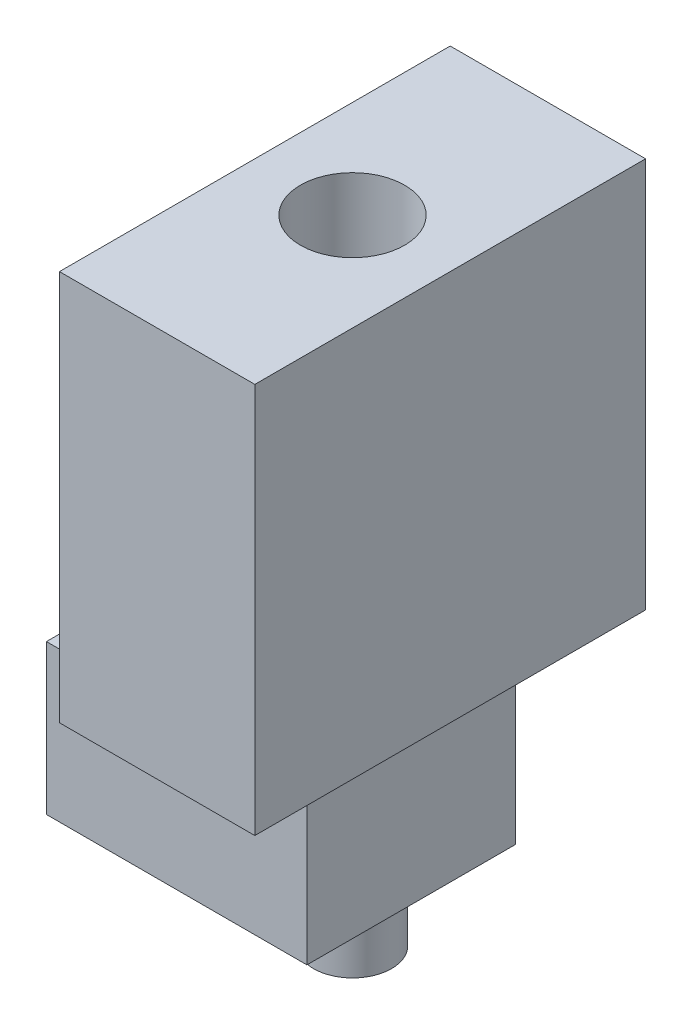
ISO-10303-21;
HEADER;
FILE_DESCRIPTION(('STEP AP214'),'2;1');
FILE_NAME('part.step','',(''),(''),'','','');
FILE_SCHEMA(('AUTOMOTIVE_DESIGN { 1 0 10303 214 1 1 1 1 }'));
ENDSEC;
DATA;
#1=APPLICATION_CONTEXT('core data for automotive mechanical design processes');
#2=APPLICATION_PROTOCOL_DEFINITION('international standard','automotive_design',2000,#1);
#3=PRODUCT_CONTEXT('',#1,'mechanical');
#4=PRODUCT('Part','Part','',(#3));
#5=PRODUCT_RELATED_PRODUCT_CATEGORY('part','',(#4));
#6=PRODUCT_DEFINITION_FORMATION('','',#4);
#7=PRODUCT_DEFINITION_CONTEXT('part definition',#1,'design');
#8=PRODUCT_DEFINITION('design','',#6,#7);
#9=PRODUCT_DEFINITION_SHAPE('','',#8);
#10=(LENGTH_UNIT() NAMED_UNIT(*) SI_UNIT(.MILLI.,.METRE.));
#11=(NAMED_UNIT(*) PLANE_ANGLE_UNIT() SI_UNIT($,.RADIAN.));
#12=(NAMED_UNIT(*) SI_UNIT($,.STERADIAN.) SOLID_ANGLE_UNIT());
#13=UNCERTAINTY_MEASURE_WITH_UNIT(LENGTH_MEASURE(1.E-05),#10,'distance_accuracy_value','');
#14=(GEOMETRIC_REPRESENTATION_CONTEXT(3) GLOBAL_UNCERTAINTY_ASSIGNED_CONTEXT((#13)) GLOBAL_UNIT_ASSIGNED_CONTEXT((#10,
#11,#12)) REPRESENTATION_CONTEXT('',''));
#15=CARTESIAN_POINT('',(0.,0.,0.));
#16=DIRECTION('',(0.,0.,1.));
#17=DIRECTION('',(1.,0.,0.));
#18=AXIS2_PLACEMENT_3D('',#15,#16,#17);
#19=CARTESIAN_POINT('',(7.5,-0.1,-15.));
#20=DIRECTION('',(0.,1.,0.));
#21=DIRECTION('',(0.,0.,1.));
#22=AXIS2_PLACEMENT_3D('',#19,#20,#21);
#23=CYLINDRICAL_SURFACE('',#22,4.);
#24=CARTESIAN_POINT('',(7.5,-0.1,-15.));
#25=DIRECTION('',(0.,-1.,0.));
#26=DIRECTION('',(0.,0.,-1.));
#27=AXIS2_PLACEMENT_3D('',#24,#25,#26);
#28=CIRCLE('',#27,4.);
#29=CARTESIAN_POINT('',(7.5,-0.1,-19.));
#30=VERTEX_POINT('',#29);
#31=EDGE_CURVE('E54',#30,#30,#28,.T.);
#32=ORIENTED_EDGE('',*,*,#31,.F.);
#33=EDGE_LOOP('',(#32));
#34=FACE_BOUND('',#33,.T.);
#35=CARTESIAN_POINT('',(7.5,0.,-15.));
#36=DIRECTION('',(0.,-1.,0.));
#37=DIRECTION('',(0.,0.,-1.));
#38=AXIS2_PLACEMENT_3D('',#35,#36,#37);
#39=CIRCLE('',#38,4.);
#40=CARTESIAN_POINT('',(7.5,0.,-19.));
#41=VERTEX_POINT('',#40);
#42=EDGE_CURVE('E48',#41,#41,#39,.T.);
#43=ORIENTED_EDGE('',*,*,#42,.T.);
#44=EDGE_LOOP('',(#43));
#45=FACE_BOUND('',#44,.T.);
#46=ADVANCED_FACE('F45',(#34,#45),#23,.T.);
#47=CARTESIAN_POINT('',(7.5,-0.1,-15.));
#48=DIRECTION('',(0.,-1.,0.));
#49=DIRECTION('',(0.,0.,-1.));
#50=AXIS2_PLACEMENT_3D('',#47,#48,#49);
#51=PLANE('',#50);
#52=CARTESIAN_POINT('',(7.5,-0.1,-15.));
#53=DIRECTION('',(0.,-1.,0.));
#54=DIRECTION('',(0.,0.,-1.));
#55=AXIS2_PLACEMENT_3D('',#52,#53,#54);
#56=CIRCLE('',#55,1.5);
#57=CARTESIAN_POINT('',(7.5,-0.1,-16.5));
#58=VERTEX_POINT('',#57);
#59=EDGE_CURVE('E12',#58,#58,#56,.T.);
#60=ORIENTED_EDGE('',*,*,#59,.F.);
#61=EDGE_LOOP('',(#60));
#62=FACE_BOUND('',#61,.T.);
#63=ORIENTED_EDGE('',*,*,#31,.T.);
#64=EDGE_LOOP('',(#63));
#65=FACE_BOUND('',#64,.T.);
#66=ADVANCED_FACE('F136',(#62,#65),#51,.T.);
#67=CARTESIAN_POINT('',(7.5,0.,-15.));
#68=DIRECTION('',(0.,-1.,0.));
#69=DIRECTION('',(0.,0.,-1.));
#70=AXIS2_PLACEMENT_3D('',#67,#68,#69);
#71=PLANE('',#70);
#72=ORIENTED_EDGE('',*,*,#42,.F.);
#73=EDGE_LOOP('',(#72));
#74=FACE_BOUND('',#73,.T.);
#75=ADVANCED_FACE('F133',(#74),#71,.F.);
#76=CARTESIAN_POINT('',(7.5,-2.1,-15.));
#77=DIRECTION('',(0.,1.,0.));
#78=DIRECTION('',(0.,0.,1.));
#79=AXIS2_PLACEMENT_3D('',#76,#77,#78);
#80=CYLINDRICAL_SURFACE('',#79,1.5);
#81=CARTESIAN_POINT('',(7.5,-2.1,-15.));
#82=DIRECTION('',(0.,-1.,0.));
#83=DIRECTION('',(0.,0.,-1.));
#84=AXIS2_PLACEMENT_3D('',#81,#82,#83);
#85=CIRCLE('',#84,1.5);
#86=CARTESIAN_POINT('',(7.5,-2.1,-16.5));
#87=VERTEX_POINT('',#86);
#88=EDGE_CURVE('E124',#87,#87,#85,.T.);
#89=ORIENTED_EDGE('',*,*,#88,.F.);
#90=EDGE_LOOP('',(#89));
#91=FACE_BOUND('',#90,.T.);
#92=ORIENTED_EDGE('',*,*,#59,.T.);
#93=EDGE_LOOP('',(#92));
#94=FACE_BOUND('',#93,.T.);
#95=ADVANCED_FACE('F135',(#91,#94),#80,.T.);
#96=CARTESIAN_POINT('',(-8.,-13.6,-6.99999999999999));
#97=DIRECTION('',(1.,0.,0.));
#98=DIRECTION('',(0.,0.,-1.));
#99=AXIS2_PLACEMENT_3D('',#96,#97,#98);
#100=PLANE('',#99);
#101=DIRECTION('',(0.,0.,-1.));
#102=VECTOR('',#101,1.);
#103=CARTESIAN_POINT('',(-8.,-2.1,-6.99999999999999));
#104=LINE('',#103,#102);
#105=CARTESIAN_POINT('',(-8.,-2.1,-6.99999999999999));
#106=VERTEX_POINT('',#105);
#107=CARTESIAN_POINT('',(-8.,-2.1,-23.));
#108=VERTEX_POINT('',#107);
#109=EDGE_CURVE('E114',#106,#108,#104,.T.);
#110=ORIENTED_EDGE('',*,*,#109,.T.);
#111=DIRECTION('',(0.,1.,0.));
#112=VECTOR('',#111,1.);
#113=CARTESIAN_POINT('',(-8.,-13.6,-23.));
#114=LINE('',#113,#112);
#115=CARTESIAN_POINT('',(-8.,-13.6,-23.));
#116=VERTEX_POINT('',#115);
#117=EDGE_CURVE('E105',#116,#108,#114,.T.);
#118=ORIENTED_EDGE('',*,*,#117,.F.);
#119=DIRECTION('',(0.,0.,-1.));
#120=VECTOR('',#119,1.);
#121=CARTESIAN_POINT('',(-8.,-13.6,-6.99999999999999));
#122=LINE('',#121,#120);
#123=CARTESIAN_POINT('',(-8.,-13.6,-6.99999999999999));
#124=VERTEX_POINT('',#123);
#125=EDGE_CURVE('E99',#124,#116,#122,.T.);
#126=ORIENTED_EDGE('',*,*,#125,.F.);
#127=DIRECTION('',(0.,1.,0.));
#128=VECTOR('',#127,1.);
#129=CARTESIAN_POINT('',(-8.,-13.6,-6.99999999999999));
#130=LINE('',#129,#128);
#131=EDGE_CURVE('E110',#124,#106,#130,.T.);
#132=ORIENTED_EDGE('',*,*,#131,.T.);
#133=EDGE_LOOP('',(#110,#118,#126,#132));
#134=FACE_BOUND('',#133,.T.);
#135=ADVANCED_FACE('F141',(#134),#100,.F.);
#136=CARTESIAN_POINT('',(-8.,-13.6,-23.));
#137=DIRECTION('',(0.,0.,1.));
#138=DIRECTION('',(1.,0.,0.));
#139=AXIS2_PLACEMENT_3D('',#136,#137,#138);
#140=PLANE('',#139);
#141=DIRECTION('',(1.,0.,0.));
#142=VECTOR('',#141,1.);
#143=CARTESIAN_POINT('',(-8.,-2.1,-23.));
#144=LINE('',#143,#142);
#145=CARTESIAN_POINT('',(12.,-2.1,-23.));
#146=VERTEX_POINT('',#145);
#147=EDGE_CURVE('E104',#108,#146,#144,.T.);
#148=ORIENTED_EDGE('',*,*,#147,.T.);
#149=DIRECTION('',(0.,1.,0.));
#150=VECTOR('',#149,1.);
#151=CARTESIAN_POINT('',(12.,-13.6,-23.));
#152=LINE('',#151,#150);
#153=CARTESIAN_POINT('',(12.,-13.6,-23.));
#154=VERTEX_POINT('',#153);
#155=EDGE_CURVE('E102',#154,#146,#152,.T.);
#156=ORIENTED_EDGE('',*,*,#155,.F.);
#157=DIRECTION('',(1.,0.,0.));
#158=VECTOR('',#157,1.);
#159=CARTESIAN_POINT('',(-8.,-13.6,-23.));
#160=LINE('',#159,#158);
#161=EDGE_CURVE('E94',#116,#154,#160,.T.);
#162=ORIENTED_EDGE('',*,*,#161,.F.);
#163=ORIENTED_EDGE('',*,*,#117,.T.);
#164=EDGE_LOOP('',(#148,#156,#162,#163));
#165=FACE_BOUND('',#164,.T.);
#166=ADVANCED_FACE('F103',(#165),#140,.F.);
#167=CARTESIAN_POINT('',(12.,-13.6,-6.99999999999999));
#168=DIRECTION('',(-1.,0.,0.));
#169=DIRECTION('',(0.,0.,1.));
#170=AXIS2_PLACEMENT_3D('',#167,#168,#169);
#171=PLANE('',#170);
#172=DIRECTION('',(0.,0.,1.));
#173=VECTOR('',#172,1.);
#174=CARTESIAN_POINT('',(12.,-2.1,-6.99999999999999));
#175=LINE('',#174,#173);
#176=CARTESIAN_POINT('',(12.,-2.1,-6.99999999999999));
#177=VERTEX_POINT('',#176);
#178=EDGE_CURVE('E80',#146,#177,#175,.T.);
#179=ORIENTED_EDGE('',*,*,#178,.T.);
#180=DIRECTION('',(0.,1.,0.));
#181=VECTOR('',#180,1.);
#182=CARTESIAN_POINT('',(12.,-13.6,-6.99999999999999));
#183=LINE('',#182,#181);
#184=CARTESIAN_POINT('',(12.,-13.6,-6.99999999999999));
#185=VERTEX_POINT('',#184);
#186=EDGE_CURVE('E106',#185,#177,#183,.T.);
#187=ORIENTED_EDGE('',*,*,#186,.F.);
#188=DIRECTION('',(0.,0.,1.));
#189=VECTOR('',#188,1.);
#190=CARTESIAN_POINT('',(12.,-13.6,-6.99999999999999));
#191=LINE('',#190,#189);
#192=EDGE_CURVE('E97',#154,#185,#191,.T.);
#193=ORIENTED_EDGE('',*,*,#192,.F.);
#194=ORIENTED_EDGE('',*,*,#155,.T.);
#195=EDGE_LOOP('',(#179,#187,#193,#194));
#196=FACE_BOUND('',#195,.T.);
#197=ADVANCED_FACE('F108',(#196),#171,.F.);
#198=CARTESIAN_POINT('',(-8.,-13.6,-6.99999999999999));
#199=DIRECTION('',(0.,0.,-1.));
#200=DIRECTION('',(-1.,0.,0.));
#201=AXIS2_PLACEMENT_3D('',#198,#199,#200);
#202=PLANE('',#201);
#203=DIRECTION('',(-1.,0.,0.));
#204=VECTOR('',#203,1.);
#205=CARTESIAN_POINT('',(-8.,-2.1,-6.99999999999999));
#206=LINE('',#205,#204);
#207=EDGE_CURVE('E86',#177,#106,#206,.T.);
#208=ORIENTED_EDGE('',*,*,#207,.T.);
#209=ORIENTED_EDGE('',*,*,#131,.F.);
#210=DIRECTION('',(-1.,0.,0.));
#211=VECTOR('',#210,1.);
#212=CARTESIAN_POINT('',(-8.,-13.6,-6.99999999999999));
#213=LINE('',#212,#211);
#214=EDGE_CURVE('E63',#185,#124,#213,.T.);
#215=ORIENTED_EDGE('',*,*,#214,.F.);
#216=ORIENTED_EDGE('',*,*,#186,.T.);
#217=EDGE_LOOP('',(#208,#209,#215,#216));
#218=FACE_BOUND('',#217,.T.);
#219=ADVANCED_FACE('F188',(#218),#202,.F.);
#220=CARTESIAN_POINT('',(0.,-13.6,0.));
#221=DIRECTION('',(0.,-1.,0.));
#222=DIRECTION('',(0.,0.,-1.));
#223=AXIS2_PLACEMENT_3D('',#220,#221,#222);
#224=PLANE('',#223);
#225=CARTESIAN_POINT('',(7.5,-13.6,-15.));
#226=DIRECTION('',(0.,-1.,0.));
#227=DIRECTION('',(0.,0.,-1.));
#228=AXIS2_PLACEMENT_3D('',#225,#226,#227);
#229=CIRCLE('',#228,3.);
#230=CARTESIAN_POINT('',(7.5,-13.6,-18.));
#231=VERTEX_POINT('',#230);
#232=EDGE_CURVE('E241',#231,#231,#229,.T.);
#233=ORIENTED_EDGE('',*,*,#232,.F.);
#234=EDGE_LOOP('',(#233));
#235=FACE_BOUND('',#234,.T.);
#236=ORIENTED_EDGE('',*,*,#125,.T.);
#237=ORIENTED_EDGE('',*,*,#161,.T.);
#238=ORIENTED_EDGE('',*,*,#192,.T.);
#239=ORIENTED_EDGE('',*,*,#214,.T.);
#240=EDGE_LOOP('',(#236,#237,#238,#239));
#241=FACE_BOUND('',#240,.T.);
#242=ADVANCED_FACE('F95',(#235,#241),#224,.T.);
#243=CARTESIAN_POINT('',(0.,-2.1,0.));
#244=DIRECTION('',(0.,-1.,0.));
#245=DIRECTION('',(0.,0.,-1.));
#246=AXIS2_PLACEMENT_3D('',#243,#244,#245);
#247=PLANE('',#246);
#248=ORIENTED_EDGE('',*,*,#88,.T.);
#249=EDGE_LOOP('',(#248));
#250=FACE_BOUND('',#249,.T.);
#251=ORIENTED_EDGE('',*,*,#109,.F.);
#252=ORIENTED_EDGE('',*,*,#207,.F.);
#253=ORIENTED_EDGE('',*,*,#178,.F.);
#254=ORIENTED_EDGE('',*,*,#147,.F.);
#255=EDGE_LOOP('',(#251,#252,#253,#254));
#256=FACE_BOUND('',#255,.T.);
#257=ADVANCED_FACE('F203',(#250,#256),#247,.F.);
#258=CARTESIAN_POINT('',(7.5,-18.6,-15.));
#259=DIRECTION('',(0.,1.,0.));
#260=DIRECTION('',(0.,0.,1.));
#261=AXIS2_PLACEMENT_3D('',#258,#259,#260);
#262=CYLINDRICAL_SURFACE('',#261,3.);
#263=CARTESIAN_POINT('',(7.5,-18.6,-15.));
#264=DIRECTION('',(0.,-1.,0.));
#265=DIRECTION('',(0.,0.,-1.));
#266=AXIS2_PLACEMENT_3D('',#263,#264,#265);
#267=CIRCLE('',#266,3.);
#268=CARTESIAN_POINT('',(7.5,-18.6,-18.));
#269=VERTEX_POINT('',#268);
#270=EDGE_CURVE('E117',#269,#269,#267,.T.);
#271=ORIENTED_EDGE('',*,*,#270,.F.);
#272=EDGE_LOOP('',(#271));
#273=FACE_BOUND('',#272,.T.);
#274=ORIENTED_EDGE('',*,*,#232,.T.);
#275=EDGE_LOOP('',(#274));
#276=FACE_BOUND('',#275,.T.);
#277=ADVANCED_FACE('F208',(#273,#276),#262,.T.);
#278=CARTESIAN_POINT('',(7.5,-18.6,-15.));
#279=DIRECTION('',(0.,-1.,0.));
#280=DIRECTION('',(0.,0.,-1.));
#281=AXIS2_PLACEMENT_3D('',#278,#279,#280);
#282=PLANE('',#281);
#283=ORIENTED_EDGE('',*,*,#270,.T.);
#284=EDGE_LOOP('',(#283));
#285=FACE_BOUND('',#284,.T.);
#286=ADVANCED_FACE('F225',(#285),#282,.T.);
#287=CLOSED_SHELL('',(#46,#66,#75,#95,#135,#166,#197,#219,#242,#257,#277,#286));
#288=MANIFOLD_SOLID_BREP('B2',#287);
#289=CARTESIAN_POINT('',(15.,0.,0.));
#290=DIRECTION('',(0.,0.,-1.));
#291=DIRECTION('',(0.,1.,0.));
#292=AXIS2_PLACEMENT_3D('',#289,#290,#291);
#293=PLANE('',#292);
#294=DIRECTION('',(0.,-1.,0.));
#295=VECTOR('',#294,1.);
#296=CARTESIAN_POINT('',(0.,0.,0.));
#297=LINE('',#296,#295);
#298=CARTESIAN_POINT('',(0.,30.,0.));
#299=VERTEX_POINT('',#298);
#300=CARTESIAN_POINT('',(0.,0.,0.));
#301=VERTEX_POINT('',#300);
#302=EDGE_CURVE('E321',#299,#301,#297,.T.);
#303=ORIENTED_EDGE('',*,*,#302,.T.);
#304=DIRECTION('',(-1.,0.,0.));
#305=VECTOR('',#304,1.);
#306=CARTESIAN_POINT('',(15.,0.,0.));
#307=LINE('',#306,#305);
#308=CARTESIAN_POINT('',(15.,0.,0.));
#309=VERTEX_POINT('',#308);
#310=EDGE_CURVE('E43',#309,#301,#307,.T.);
#311=ORIENTED_EDGE('',*,*,#310,.F.);
#312=DIRECTION('',(0.,-1.,0.));
#313=VECTOR('',#312,1.);
#314=CARTESIAN_POINT('',(15.,0.,0.));
#315=LINE('',#314,#313);
#316=CARTESIAN_POINT('',(15.,30.,0.));
#317=VERTEX_POINT('',#316);
#318=EDGE_CURVE('E309',#317,#309,#315,.T.);
#319=ORIENTED_EDGE('',*,*,#318,.F.);
#320=DIRECTION('',(-1.,0.,0.));
#321=VECTOR('',#320,1.);
#322=CARTESIAN_POINT('',(15.,30.,0.));
#323=LINE('',#322,#321);
#324=EDGE_CURVE('E317',#317,#299,#323,.T.);
#325=ORIENTED_EDGE('',*,*,#324,.T.);
#326=EDGE_LOOP('',(#303,#311,#319,#325));
#327=FACE_BOUND('',#326,.T.);
#328=ADVANCED_FACE('F258',(#327),#293,.F.);
#329=CARTESIAN_POINT('',(15.,0.,0.));
#330=DIRECTION('',(0.,1.,0.));
#331=DIRECTION('',(0.,0.,1.));
#332=AXIS2_PLACEMENT_3D('',#329,#330,#331);
#333=PLANE('',#332);
#334=CARTESIAN_POINT('',(7.5,0.,-15.));
#335=DIRECTION('',(0.,1.,0.));
#336=DIRECTION('',(0.,0.,1.));
#337=AXIS2_PLACEMENT_3D('',#334,#335,#336);
#338=CIRCLE('',#337,4.);
#339=CARTESIAN_POINT('',(7.5,0.,-11.));
#340=VERTEX_POINT('',#339);
#341=EDGE_CURVE('E324',#340,#340,#338,.T.);
#342=ORIENTED_EDGE('',*,*,#341,.T.);
#343=EDGE_LOOP('',(#342));
#344=FACE_BOUND('',#343,.T.);
#345=DIRECTION('',(0.,0.,-1.));
#346=VECTOR('',#345,1.);
#347=CARTESIAN_POINT('',(0.,0.,0.));
#348=LINE('',#347,#346);
#349=CARTESIAN_POINT('',(0.,0.,-30.));
#350=VERTEX_POINT('',#349);
#351=EDGE_CURVE('E313',#301,#350,#348,.T.);
#352=ORIENTED_EDGE('',*,*,#351,.T.);
#353=DIRECTION('',(-1.,0.,0.));
#354=VECTOR('',#353,1.);
#355=CARTESIAN_POINT('',(15.,0.,-30.));
#356=LINE('',#355,#354);
#357=CARTESIAN_POINT('',(15.,0.,-30.));
#358=VERTEX_POINT('',#357);
#359=EDGE_CURVE('E266',#358,#350,#356,.T.);
#360=ORIENTED_EDGE('',*,*,#359,.F.);
#361=DIRECTION('',(0.,0.,-1.));
#362=VECTOR('',#361,1.);
#363=CARTESIAN_POINT('',(15.,0.,0.));
#364=LINE('',#363,#362);
#365=EDGE_CURVE('E304',#309,#358,#364,.T.);
#366=ORIENTED_EDGE('',*,*,#365,.F.);
#367=ORIENTED_EDGE('',*,*,#310,.T.);
#368=EDGE_LOOP('',(#352,#360,#366,#367));
#369=FACE_BOUND('',#368,.T.);
#370=ADVANCED_FACE('F312',(#344,#369),#333,.F.);
#371=CARTESIAN_POINT('',(15.,0.,-30.));
#372=DIRECTION('',(0.,0.,1.));
#373=DIRECTION('',(0.,-1.,0.));
#374=AXIS2_PLACEMENT_3D('',#371,#372,#373);
#375=PLANE('',#374);
#376=DIRECTION('',(0.,1.,0.));
#377=VECTOR('',#376,1.);
#378=CARTESIAN_POINT('',(0.,0.,-30.));
#379=LINE('',#378,#377);
#380=CARTESIAN_POINT('',(0.,30.,-30.));
#381=VERTEX_POINT('',#380);
#382=EDGE_CURVE('E291',#350,#381,#379,.T.);
#383=ORIENTED_EDGE('',*,*,#382,.T.);
#384=DIRECTION('',(-1.,0.,0.));
#385=VECTOR('',#384,1.);
#386=CARTESIAN_POINT('',(15.,30.,-30.));
#387=LINE('',#386,#385);
#388=CARTESIAN_POINT('',(15.,30.,-30.));
#389=VERTEX_POINT('',#388);
#390=EDGE_CURVE('E314',#389,#381,#387,.T.);
#391=ORIENTED_EDGE('',*,*,#390,.F.);
#392=DIRECTION('',(0.,1.,0.));
#393=VECTOR('',#392,1.);
#394=CARTESIAN_POINT('',(15.,0.,-30.));
#395=LINE('',#394,#393);
#396=EDGE_CURVE('E307',#358,#389,#395,.T.);
#397=ORIENTED_EDGE('',*,*,#396,.F.);
#398=ORIENTED_EDGE('',*,*,#359,.T.);
#399=EDGE_LOOP('',(#383,#391,#397,#398));
#400=FACE_BOUND('',#399,.T.);
#401=ADVANCED_FACE('F315',(#400),#375,.F.);
#402=CARTESIAN_POINT('',(15.,30.,0.));
#403=DIRECTION('',(0.,-1.,0.));
#404=DIRECTION('',(0.,0.,-1.));
#405=AXIS2_PLACEMENT_3D('',#402,#403,#404);
#406=PLANE('',#405);
#407=CARTESIAN_POINT('',(7.5,30.,-15.));
#408=DIRECTION('',(0.,1.,0.));
#409=DIRECTION('',(0.,0.,1.));
#410=AXIS2_PLACEMENT_3D('',#407,#408,#409);
#411=CIRCLE('',#410,4.);
#412=CARTESIAN_POINT('',(7.5,30.,-11.));
#413=VERTEX_POINT('',#412);
#414=EDGE_CURVE('E337',#413,#413,#411,.T.);
#415=ORIENTED_EDGE('',*,*,#414,.F.);
#416=EDGE_LOOP('',(#415));
#417=FACE_BOUND('',#416,.T.);
#418=DIRECTION('',(0.,0.,1.));
#419=VECTOR('',#418,1.);
#420=CARTESIAN_POINT('',(0.,30.,0.));
#421=LINE('',#420,#419);
#422=EDGE_CURVE('E297',#381,#299,#421,.T.);
#423=ORIENTED_EDGE('',*,*,#422,.T.);
#424=ORIENTED_EDGE('',*,*,#324,.F.);
#425=DIRECTION('',(0.,0.,1.));
#426=VECTOR('',#425,1.);
#427=CARTESIAN_POINT('',(15.,30.,0.));
#428=LINE('',#427,#426);
#429=EDGE_CURVE('E274',#389,#317,#428,.T.);
#430=ORIENTED_EDGE('',*,*,#429,.F.);
#431=ORIENTED_EDGE('',*,*,#390,.T.);
#432=EDGE_LOOP('',(#423,#424,#430,#431));
#433=FACE_BOUND('',#432,.T.);
#434=ADVANCED_FACE('F329',(#417,#433),#406,.F.);
#435=CARTESIAN_POINT('',(15.,0.,0.));
#436=DIRECTION('',(-1.,0.,0.));
#437=DIRECTION('',(0.,0.,1.));
#438=AXIS2_PLACEMENT_3D('',#435,#436,#437);
#439=PLANE('',#438);
#440=ORIENTED_EDGE('',*,*,#318,.T.);
#441=ORIENTED_EDGE('',*,*,#365,.T.);
#442=ORIENTED_EDGE('',*,*,#396,.T.);
#443=ORIENTED_EDGE('',*,*,#429,.T.);
#444=EDGE_LOOP('',(#440,#441,#442,#443));
#445=FACE_BOUND('',#444,.T.);
#446=ADVANCED_FACE('F305',(#445),#439,.F.);
#447=CARTESIAN_POINT('',(0.,0.,0.));
#448=DIRECTION('',(-1.,0.,0.));
#449=DIRECTION('',(0.,0.,1.));
#450=AXIS2_PLACEMENT_3D('',#447,#448,#449);
#451=PLANE('',#450);
#452=ORIENTED_EDGE('',*,*,#302,.F.);
#453=ORIENTED_EDGE('',*,*,#422,.F.);
#454=ORIENTED_EDGE('',*,*,#382,.F.);
#455=ORIENTED_EDGE('',*,*,#351,.F.);
#456=EDGE_LOOP('',(#452,#453,#454,#455));
#457=FACE_BOUND('',#456,.T.);
#458=ADVANCED_FACE('F332',(#457),#451,.T.);
#459=CARTESIAN_POINT('',(7.5,30.,-15.));
#460=DIRECTION('',(0.,1.,0.));
#461=DIRECTION('',(0.,0.,1.));
#462=AXIS2_PLACEMENT_3D('',#459,#460,#461);
#463=CYLINDRICAL_SURFACE('',#462,4.);
#464=ORIENTED_EDGE('',*,*,#341,.F.);
#465=EDGE_LOOP('',(#464));
#466=FACE_BOUND('',#465,.T.);
#467=ORIENTED_EDGE('',*,*,#414,.T.);
#468=EDGE_LOOP('',(#467));
#469=FACE_BOUND('',#468,.T.);
#470=ADVANCED_FACE('F341',(#466,#469),#463,.F.);
#471=CLOSED_SHELL('',(#328,#370,#401,#434,#446,#458,#470));
#472=MANIFOLD_SOLID_BREP('B6',#471);
#473=ADVANCED_BREP_SHAPE_REPRESENTATION('',(#18,#288,#472),#14);
#474=SHAPE_DEFINITION_REPRESENTATION(#9,#473);
ENDSEC;
END-ISO-10303-21;
